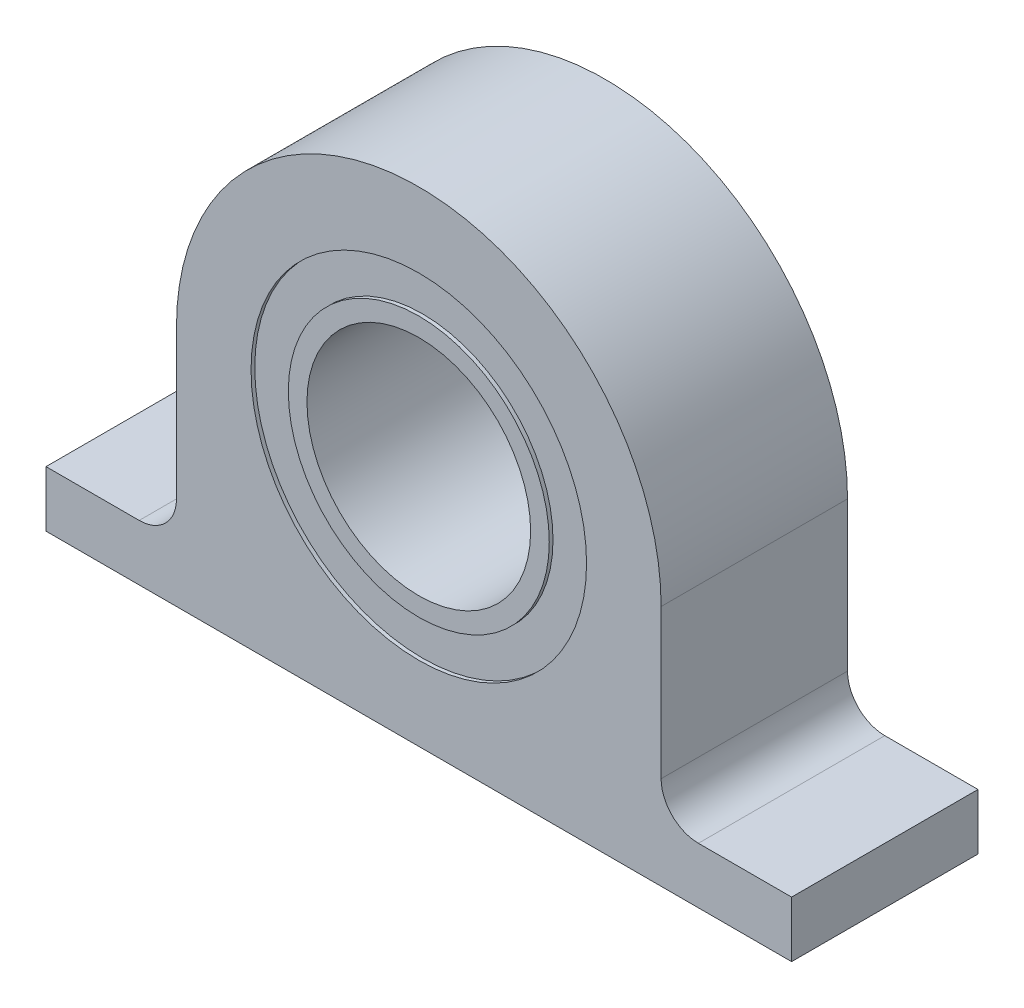
ISO-10303-21;
HEADER;
FILE_DESCRIPTION(('STEP AP214'),'2;1');
FILE_NAME('part.step','',(''),(''),'','','');
FILE_SCHEMA(('AUTOMOTIVE_DESIGN { 1 0 10303 214 1 1 1 1 }'));
ENDSEC;
DATA;
#1=APPLICATION_CONTEXT('core data for automotive mechanical design processes');
#2=APPLICATION_PROTOCOL_DEFINITION('international standard','automotive_design',2000,#1);
#3=PRODUCT_CONTEXT('',#1,'mechanical');
#4=PRODUCT('Part','Part','',(#3));
#5=PRODUCT_RELATED_PRODUCT_CATEGORY('part','',(#4));
#6=PRODUCT_DEFINITION_FORMATION('','',#4);
#7=PRODUCT_DEFINITION_CONTEXT('part definition',#1,'design');
#8=PRODUCT_DEFINITION('design','',#6,#7);
#9=PRODUCT_DEFINITION_SHAPE('','',#8);
#10=(LENGTH_UNIT() NAMED_UNIT(*) SI_UNIT(.MILLI.,.METRE.));
#11=(NAMED_UNIT(*) PLANE_ANGLE_UNIT() SI_UNIT($,.RADIAN.));
#12=(NAMED_UNIT(*) SI_UNIT($,.STERADIAN.) SOLID_ANGLE_UNIT());
#13=UNCERTAINTY_MEASURE_WITH_UNIT(LENGTH_MEASURE(1.E-05),#10,'distance_accuracy_value','');
#14=(GEOMETRIC_REPRESENTATION_CONTEXT(3) GLOBAL_UNCERTAINTY_ASSIGNED_CONTEXT((#13)) GLOBAL_UNIT_ASSIGNED_CONTEXT((#10,
#11,#12)) REPRESENTATION_CONTEXT('',''));
#15=CARTESIAN_POINT('',(0.,0.,0.));
#16=DIRECTION('',(0.,0.,1.));
#17=DIRECTION('',(1.,0.,0.));
#18=AXIS2_PLACEMENT_3D('',#15,#16,#17);
#19=CARTESIAN_POINT('',(0.,0.,0.));
#20=DIRECTION('',(0.,0.,1.));
#21=DIRECTION('',(1.,0.,0.));
#22=AXIS2_PLACEMENT_3D('',#19,#20,#21);
#23=PLANE('',#22);
#24=CARTESIAN_POINT('',(0.,0.,0.));
#25=DIRECTION('',(0.,0.,1.));
#26=DIRECTION('',(1.,0.,0.));
#27=AXIS2_PLACEMENT_3D('',#24,#25,#26);
#28=CIRCLE('',#27,7.62);
#29=CARTESIAN_POINT('',(7.62,0.,0.));
#30=VERTEX_POINT('',#29);
#31=EDGE_CURVE('E38',#30,#30,#28,.T.);
#32=ORIENTED_EDGE('',*,*,#31,.T.);
#33=EDGE_LOOP('',(#32));
#34=FACE_BOUND('',#33,.T.);
#35=CARTESIAN_POINT('',(0.,0.,0.));
#36=DIRECTION('',(0.,0.,1.));
#37=DIRECTION('',(1.,0.,0.));
#38=AXIS2_PLACEMENT_3D('',#35,#36,#37);
#39=CIRCLE('',#38,8.89);
#40=CARTESIAN_POINT('',(8.89,0.,0.));
#41=VERTEX_POINT('',#40);
#42=EDGE_CURVE('E195',#41,#41,#39,.T.);
#43=ORIENTED_EDGE('',*,*,#42,.F.);
#44=EDGE_LOOP('',(#43));
#45=FACE_BOUND('',#44,.T.);
#46=ADVANCED_FACE('F34',(#34,#45),#23,.F.);
#47=CARTESIAN_POINT('',(0.,0.,12.7));
#48=DIRECTION('',(0.,0.,1.));
#49=DIRECTION('',(1.,0.,0.));
#50=AXIS2_PLACEMENT_3D('',#47,#48,#49);
#51=PLANE('',#50);
#52=CARTESIAN_POINT('',(0.,0.,12.7));
#53=DIRECTION('',(0.,0.,1.));
#54=DIRECTION('',(1.,0.,0.));
#55=AXIS2_PLACEMENT_3D('',#52,#53,#54);
#56=CIRCLE('',#55,7.62);
#57=CARTESIAN_POINT('',(7.62,0.,12.7));
#58=VERTEX_POINT('',#57);
#59=EDGE_CURVE('E11',#58,#58,#56,.T.);
#60=ORIENTED_EDGE('',*,*,#59,.F.);
#61=EDGE_LOOP('',(#60));
#62=FACE_BOUND('',#61,.T.);
#63=CARTESIAN_POINT('',(0.,0.,12.7));
#64=DIRECTION('',(0.,0.,1.));
#65=DIRECTION('',(1.,0.,0.));
#66=AXIS2_PLACEMENT_3D('',#63,#64,#65);
#67=CIRCLE('',#66,8.89);
#68=CARTESIAN_POINT('',(8.89,0.,12.7));
#69=VERTEX_POINT('',#68);
#70=EDGE_CURVE('E203',#69,#69,#67,.T.);
#71=ORIENTED_EDGE('',*,*,#70,.T.);
#72=EDGE_LOOP('',(#71));
#73=FACE_BOUND('',#72,.T.);
#74=ADVANCED_FACE('F223',(#62,#73),#51,.T.);
#75=CARTESIAN_POINT('',(0.,0.,12.7));
#76=DIRECTION('',(0.,0.,1.));
#77=DIRECTION('',(1.,0.,0.));
#78=AXIS2_PLACEMENT_3D('',#75,#76,#77);
#79=CIRCLE('',#78,11.43);
#80=CARTESIAN_POINT('',(11.43,0.,12.7));
#81=VERTEX_POINT('',#80);
#82=EDGE_CURVE('E212',#81,#81,#79,.T.);
#83=ORIENTED_EDGE('',*,*,#82,.F.);
#84=EDGE_LOOP('',(#83));
#85=FACE_BOUND('',#84,.T.);
#86=DIRECTION('',(-1.,0.,0.));
#87=VECTOR('',#86,1.);
#88=CARTESIAN_POINT('',(-25.4,-12.7,12.7));
#89=LINE('',#88,#87);
#90=CARTESIAN_POINT('',(-19.05,-12.7,12.7));
#91=VERTEX_POINT('',#90);
#92=CARTESIAN_POINT('',(-25.4,-12.7,12.7));
#93=VERTEX_POINT('',#92);
#94=EDGE_CURVE('E115',#91,#93,#89,.T.);
#95=ORIENTED_EDGE('',*,*,#94,.T.);
#96=DIRECTION('',(0.,-1.,0.));
#97=VECTOR('',#96,1.);
#98=CARTESIAN_POINT('',(-25.4,-12.7,12.7));
#99=LINE('',#98,#97);
#100=CARTESIAN_POINT('',(-25.4,-16.51,12.7));
#101=VERTEX_POINT('',#100);
#102=EDGE_CURVE('E124',#93,#101,#99,.T.);
#103=ORIENTED_EDGE('',*,*,#102,.T.);
#104=DIRECTION('',(1.,0.,0.));
#105=VECTOR('',#104,1.);
#106=CARTESIAN_POINT('',(-25.4,-16.51,12.7));
#107=LINE('',#106,#105);
#108=CARTESIAN_POINT('',(25.4,-16.51,12.7));
#109=VERTEX_POINT('',#108);
#110=EDGE_CURVE('E57',#101,#109,#107,.T.);
#111=ORIENTED_EDGE('',*,*,#110,.T.);
#112=DIRECTION('',(0.,1.,0.));
#113=VECTOR('',#112,1.);
#114=CARTESIAN_POINT('',(25.4,-12.7,12.7));
#115=LINE('',#114,#113);
#116=CARTESIAN_POINT('',(25.4,-12.7,12.7));
#117=VERTEX_POINT('',#116);
#118=EDGE_CURVE('E150',#109,#117,#115,.T.);
#119=ORIENTED_EDGE('',*,*,#118,.T.);
#120=DIRECTION('',(-1.,0.,0.));
#121=VECTOR('',#120,1.);
#122=CARTESIAN_POINT('',(19.05,-12.7,12.7));
#123=LINE('',#122,#121);
#124=CARTESIAN_POINT('',(19.05,-12.7,12.7));
#125=VERTEX_POINT('',#124);
#126=EDGE_CURVE('E147',#117,#125,#123,.T.);
#127=ORIENTED_EDGE('',*,*,#126,.T.);
#128=CARTESIAN_POINT('',(19.05,-10.16,12.7));
#129=DIRECTION('',(0.,0.,1.));
#130=DIRECTION('',(1.,0.,0.));
#131=AXIS2_PLACEMENT_3D('',#128,#129,#130);
#132=CIRCLE('',#131,2.54);
#133=CARTESIAN_POINT('',(16.51,-10.16,12.7));
#134=VERTEX_POINT('',#133);
#135=EDGE_CURVE('E144',#125,#134,#132,.F.);
#136=ORIENTED_EDGE('',*,*,#135,.T.);
#137=DIRECTION('',(0.,1.,0.));
#138=VECTOR('',#137,1.);
#139=CARTESIAN_POINT('',(16.51,-10.16,12.7));
#140=LINE('',#139,#138);
#141=CARTESIAN_POINT('',(16.51,0.,12.7));
#142=VERTEX_POINT('',#141);
#143=EDGE_CURVE('E141',#134,#142,#140,.T.);
#144=ORIENTED_EDGE('',*,*,#143,.T.);
#145=CARTESIAN_POINT('',(0.,0.,12.7));
#146=DIRECTION('',(0.,0.,1.));
#147=DIRECTION('',(1.,0.,0.));
#148=AXIS2_PLACEMENT_3D('',#145,#146,#147);
#149=CIRCLE('',#148,16.51);
#150=CARTESIAN_POINT('',(-16.51,0.,12.7));
#151=VERTEX_POINT('',#150);
#152=EDGE_CURVE('E138',#142,#151,#149,.T.);
#153=ORIENTED_EDGE('',*,*,#152,.T.);
#154=DIRECTION('',(0.,-1.,0.));
#155=VECTOR('',#154,1.);
#156=CARTESIAN_POINT('',(-16.51,0.,12.7));
#157=LINE('',#156,#155);
#158=CARTESIAN_POINT('',(-16.51,-10.16,12.7));
#159=VERTEX_POINT('',#158);
#160=EDGE_CURVE('E134',#151,#159,#157,.T.);
#161=ORIENTED_EDGE('',*,*,#160,.T.);
#162=CARTESIAN_POINT('',(-19.05,-10.16,12.7));
#163=DIRECTION('',(0.,0.,1.));
#164=DIRECTION('',(1.,0.,0.));
#165=AXIS2_PLACEMENT_3D('',#162,#163,#164);
#166=CIRCLE('',#165,2.54);
#167=EDGE_CURVE('E132',#159,#91,#166,.F.);
#168=ORIENTED_EDGE('',*,*,#167,.T.);
#169=EDGE_LOOP('',(#95,#103,#111,#119,#127,#136,#144,#153,#161,#168));
#170=FACE_BOUND('',#169,.T.);
#171=ADVANCED_FACE('F130',(#85,#170),#51,.T.);
#172=CARTESIAN_POINT('',(0.,0.,0.));
#173=DIRECTION('',(0.,0.,1.));
#174=DIRECTION('',(1.,0.,0.));
#175=AXIS2_PLACEMENT_3D('',#172,#173,#174);
#176=CIRCLE('',#175,11.43);
#177=CARTESIAN_POINT('',(11.43,0.,0.));
#178=VERTEX_POINT('',#177);
#179=EDGE_CURVE('E200',#178,#178,#176,.T.);
#180=ORIENTED_EDGE('',*,*,#179,.T.);
#181=EDGE_LOOP('',(#180));
#182=FACE_BOUND('',#181,.T.);
#183=DIRECTION('',(0.,-1.,0.));
#184=VECTOR('',#183,1.);
#185=CARTESIAN_POINT('',(-25.4,-12.7,0.));
#186=LINE('',#185,#184);
#187=CARTESIAN_POINT('',(-25.4,-12.7,0.));
#188=VERTEX_POINT('',#187);
#189=CARTESIAN_POINT('',(-25.4,-16.51,0.));
#190=VERTEX_POINT('',#189);
#191=EDGE_CURVE('E128',#188,#190,#186,.T.);
#192=ORIENTED_EDGE('',*,*,#191,.F.);
#193=DIRECTION('',(-1.,0.,0.));
#194=VECTOR('',#193,1.);
#195=CARTESIAN_POINT('',(-25.4,-12.7,0.));
#196=LINE('',#195,#194);
#197=CARTESIAN_POINT('',(-19.05,-12.7,0.));
#198=VERTEX_POINT('',#197);
#199=EDGE_CURVE('E118',#198,#188,#196,.T.);
#200=ORIENTED_EDGE('',*,*,#199,.F.);
#201=CARTESIAN_POINT('',(-19.05,-10.16,0.));
#202=DIRECTION('',(0.,0.,-1.));
#203=DIRECTION('',(1.,0.,0.));
#204=AXIS2_PLACEMENT_3D('',#201,#202,#203);
#205=CIRCLE('',#204,2.54);
#206=CARTESIAN_POINT('',(-16.51,-10.16,0.));
#207=VERTEX_POINT('',#206);
#208=EDGE_CURVE('E176',#207,#198,#205,.T.);
#209=ORIENTED_EDGE('',*,*,#208,.F.);
#210=DIRECTION('',(0.,-1.,0.));
#211=VECTOR('',#210,1.);
#212=CARTESIAN_POINT('',(-16.51,0.,0.));
#213=LINE('',#212,#211);
#214=CARTESIAN_POINT('',(-16.51,0.,0.));
#215=VERTEX_POINT('',#214);
#216=EDGE_CURVE('E173',#215,#207,#213,.T.);
#217=ORIENTED_EDGE('',*,*,#216,.F.);
#218=CARTESIAN_POINT('',(0.,0.,0.));
#219=DIRECTION('',(0.,0.,1.));
#220=DIRECTION('',(-1.,0.,0.));
#221=AXIS2_PLACEMENT_3D('',#218,#219,#220);
#222=CIRCLE('',#221,16.51);
#223=CARTESIAN_POINT('',(16.51,0.,0.));
#224=VERTEX_POINT('',#223);
#225=EDGE_CURVE('E170',#224,#215,#222,.T.);
#226=ORIENTED_EDGE('',*,*,#225,.F.);
#227=DIRECTION('',(0.,1.,0.));
#228=VECTOR('',#227,1.);
#229=CARTESIAN_POINT('',(16.51,-10.16,0.));
#230=LINE('',#229,#228);
#231=CARTESIAN_POINT('',(16.51,-10.16,0.));
#232=VERTEX_POINT('',#231);
#233=EDGE_CURVE('E167',#232,#224,#230,.T.);
#234=ORIENTED_EDGE('',*,*,#233,.F.);
#235=CARTESIAN_POINT('',(19.05,-10.16,0.));
#236=DIRECTION('',(0.,0.,-1.));
#237=DIRECTION('',(1.,0.,0.));
#238=AXIS2_PLACEMENT_3D('',#235,#236,#237);
#239=CIRCLE('',#238,2.54);
#240=CARTESIAN_POINT('',(19.05,-12.7,0.));
#241=VERTEX_POINT('',#240);
#242=EDGE_CURVE('E164',#241,#232,#239,.T.);
#243=ORIENTED_EDGE('',*,*,#242,.F.);
#244=DIRECTION('',(-1.,0.,0.));
#245=VECTOR('',#244,1.);
#246=CARTESIAN_POINT('',(19.05,-12.7,0.));
#247=LINE('',#246,#245);
#248=CARTESIAN_POINT('',(25.4,-12.7,0.));
#249=VERTEX_POINT('',#248);
#250=EDGE_CURVE('E161',#249,#241,#247,.T.);
#251=ORIENTED_EDGE('',*,*,#250,.F.);
#252=DIRECTION('',(0.,1.,0.));
#253=VECTOR('',#252,1.);
#254=CARTESIAN_POINT('',(25.4,-12.7,0.));
#255=LINE('',#254,#253);
#256=CARTESIAN_POINT('',(25.4,-16.51,0.));
#257=VERTEX_POINT('',#256);
#258=EDGE_CURVE('E158',#257,#249,#255,.T.);
#259=ORIENTED_EDGE('',*,*,#258,.F.);
#260=DIRECTION('',(1.,0.,0.));
#261=VECTOR('',#260,1.);
#262=CARTESIAN_POINT('',(-25.4,-16.51,0.));
#263=LINE('',#262,#261);
#264=EDGE_CURVE('E155',#190,#257,#263,.T.);
#265=ORIENTED_EDGE('',*,*,#264,.F.);
#266=EDGE_LOOP('',(#192,#200,#209,#217,#226,#234,#243,#251,#259,#265));
#267=FACE_BOUND('',#266,.T.);
#268=ADVANCED_FACE('F36',(#182,#267),#23,.F.);
#269=CARTESIAN_POINT('',(0.,0.,12.7));
#270=DIRECTION('',(0.,0.,-1.));
#271=DIRECTION('',(-1.,0.,0.));
#272=AXIS2_PLACEMENT_3D('',#269,#270,#271);
#273=CYLINDRICAL_SURFACE('',#272,7.62);
#274=ORIENTED_EDGE('',*,*,#59,.T.);
#275=EDGE_LOOP('',(#274));
#276=FACE_BOUND('',#275,.T.);
#277=ORIENTED_EDGE('',*,*,#31,.F.);
#278=EDGE_LOOP('',(#277));
#279=FACE_BOUND('',#278,.T.);
#280=ADVANCED_FACE('F228',(#276,#279),#273,.F.);
#281=CARTESIAN_POINT('',(0.,0.,12.446));
#282=DIRECTION('',(0.,0.,1.));
#283=DIRECTION('',(1.,0.,0.));
#284=AXIS2_PLACEMENT_3D('',#281,#282,#283);
#285=CYLINDRICAL_SURFACE('',#284,8.89);
#286=CARTESIAN_POINT('',(0.,0.,12.446));
#287=DIRECTION('',(0.,0.,1.));
#288=DIRECTION('',(1.,0.,0.));
#289=AXIS2_PLACEMENT_3D('',#286,#287,#288);
#290=CIRCLE('',#289,8.89);
#291=CARTESIAN_POINT('',(8.89,0.,12.446));
#292=VERTEX_POINT('',#291);
#293=EDGE_CURVE('E208',#292,#292,#290,.T.);
#294=ORIENTED_EDGE('',*,*,#293,.T.);
#295=EDGE_LOOP('',(#294));
#296=FACE_BOUND('',#295,.T.);
#297=ORIENTED_EDGE('',*,*,#70,.F.);
#298=EDGE_LOOP('',(#297));
#299=FACE_BOUND('',#298,.T.);
#300=ADVANCED_FACE('F261',(#296,#299),#285,.T.);
#301=CARTESIAN_POINT('',(0.,0.,12.446));
#302=DIRECTION('',(0.,0.,1.));
#303=DIRECTION('',(1.,0.,0.));
#304=AXIS2_PLACEMENT_3D('',#301,#302,#303);
#305=CYLINDRICAL_SURFACE('',#304,11.43);
#306=CARTESIAN_POINT('',(0.,0.,12.446));
#307=DIRECTION('',(0.,0.,1.));
#308=DIRECTION('',(1.,0.,0.));
#309=AXIS2_PLACEMENT_3D('',#306,#307,#308);
#310=CIRCLE('',#309,11.43);
#311=CARTESIAN_POINT('',(11.43,0.,12.446));
#312=VERTEX_POINT('',#311);
#313=EDGE_CURVE('E211',#312,#312,#310,.T.);
#314=ORIENTED_EDGE('',*,*,#313,.F.);
#315=EDGE_LOOP('',(#314));
#316=FACE_BOUND('',#315,.T.);
#317=ORIENTED_EDGE('',*,*,#82,.T.);
#318=EDGE_LOOP('',(#317));
#319=FACE_BOUND('',#318,.T.);
#320=ADVANCED_FACE('F220',(#316,#319),#305,.F.);
#321=CARTESIAN_POINT('',(0.,0.,12.446));
#322=DIRECTION('',(0.,0.,1.));
#323=DIRECTION('',(1.,0.,0.));
#324=AXIS2_PLACEMENT_3D('',#321,#322,#323);
#325=PLANE('',#324);
#326=ORIENTED_EDGE('',*,*,#293,.F.);
#327=EDGE_LOOP('',(#326));
#328=FACE_BOUND('',#327,.T.);
#329=ORIENTED_EDGE('',*,*,#313,.T.);
#330=EDGE_LOOP('',(#329));
#331=FACE_BOUND('',#330,.T.);
#332=ADVANCED_FACE('F244',(#328,#331),#325,.T.);
#333=CARTESIAN_POINT('',(0.,0.,0.254));
#334=DIRECTION('',(0.,0.,-1.));
#335=DIRECTION('',(-1.,0.,0.));
#336=AXIS2_PLACEMENT_3D('',#333,#334,#335);
#337=CYLINDRICAL_SURFACE('',#336,8.89);
#338=CARTESIAN_POINT('',(0.,0.,0.254));
#339=DIRECTION('',(0.,0.,1.));
#340=DIRECTION('',(1.,0.,0.));
#341=AXIS2_PLACEMENT_3D('',#338,#339,#340);
#342=CIRCLE('',#341,8.89);
#343=CARTESIAN_POINT('',(8.89,0.,0.254));
#344=VERTEX_POINT('',#343);
#345=EDGE_CURVE('E196',#344,#344,#342,.T.);
#346=ORIENTED_EDGE('',*,*,#345,.F.);
#347=EDGE_LOOP('',(#346));
#348=FACE_BOUND('',#347,.T.);
#349=ORIENTED_EDGE('',*,*,#42,.T.);
#350=EDGE_LOOP('',(#349));
#351=FACE_BOUND('',#350,.T.);
#352=ADVANCED_FACE('F241',(#348,#351),#337,.T.);
#353=CARTESIAN_POINT('',(0.,0.,0.254));
#354=DIRECTION('',(0.,0.,-1.));
#355=DIRECTION('',(-1.,0.,0.));
#356=AXIS2_PLACEMENT_3D('',#353,#354,#355);
#357=CYLINDRICAL_SURFACE('',#356,11.43);
#358=CARTESIAN_POINT('',(0.,0.,0.254));
#359=DIRECTION('',(0.,0.,1.));
#360=DIRECTION('',(1.,0.,0.));
#361=AXIS2_PLACEMENT_3D('',#358,#359,#360);
#362=CIRCLE('',#361,11.43);
#363=CARTESIAN_POINT('',(11.43,0.,0.254));
#364=VERTEX_POINT('',#363);
#365=EDGE_CURVE('E199',#364,#364,#362,.T.);
#366=ORIENTED_EDGE('',*,*,#365,.T.);
#367=EDGE_LOOP('',(#366));
#368=FACE_BOUND('',#367,.T.);
#369=ORIENTED_EDGE('',*,*,#179,.F.);
#370=EDGE_LOOP('',(#369));
#371=FACE_BOUND('',#370,.T.);
#372=ADVANCED_FACE('F243',(#368,#371),#357,.F.);
#373=CARTESIAN_POINT('',(0.,0.,0.254));
#374=DIRECTION('',(0.,0.,-1.));
#375=DIRECTION('',(1.,0.,0.));
#376=AXIS2_PLACEMENT_3D('',#373,#374,#375);
#377=PLANE('',#376);
#378=ORIENTED_EDGE('',*,*,#345,.T.);
#379=EDGE_LOOP('',(#378));
#380=FACE_BOUND('',#379,.T.);
#381=ORIENTED_EDGE('',*,*,#365,.F.);
#382=EDGE_LOOP('',(#381));
#383=FACE_BOUND('',#382,.T.);
#384=ADVANCED_FACE('F251',(#380,#383),#377,.T.);
#385=CARTESIAN_POINT('',(-25.4,-12.7,73.2884510447329));
#386=DIRECTION('',(0.,-1.,0.));
#387=DIRECTION('',(0.,0.,-1.));
#388=AXIS2_PLACEMENT_3D('',#385,#386,#387);
#389=PLANE('',#388);
#390=ORIENTED_EDGE('',*,*,#94,.F.);
#391=DIRECTION('',(0.,0.,-1.));
#392=VECTOR('',#391,1.);
#393=CARTESIAN_POINT('',(-19.05,-12.7,73.2884510447329));
#394=LINE('',#393,#392);
#395=EDGE_CURVE('E49',#91,#198,#394,.T.);
#396=ORIENTED_EDGE('',*,*,#395,.T.);
#397=ORIENTED_EDGE('',*,*,#199,.T.);
#398=DIRECTION('',(0.,0.,-1.));
#399=VECTOR('',#398,1.);
#400=CARTESIAN_POINT('',(-25.4,-12.7,73.2884510447329));
#401=LINE('',#400,#399);
#402=EDGE_CURVE('E111',#93,#188,#401,.T.);
#403=ORIENTED_EDGE('',*,*,#402,.F.);
#404=EDGE_LOOP('',(#390,#396,#397,#403));
#405=FACE_BOUND('',#404,.T.);
#406=ADVANCED_FACE('F113',(#405),#389,.F.);
#407=CARTESIAN_POINT('',(-19.05,-10.16,73.2884510447329));
#408=DIRECTION('',(0.,0.,-1.));
#409=DIRECTION('',(-1.,0.,0.));
#410=AXIS2_PLACEMENT_3D('',#407,#408,#409);
#411=CYLINDRICAL_SURFACE('',#410,2.54);
#412=ORIENTED_EDGE('',*,*,#167,.F.);
#413=DIRECTION('',(0.,0.,-1.));
#414=VECTOR('',#413,1.);
#415=CARTESIAN_POINT('',(-16.51,-10.16,73.2884510447329));
#416=LINE('',#415,#414);
#417=EDGE_CURVE('E180',#159,#207,#416,.T.);
#418=ORIENTED_EDGE('',*,*,#417,.T.);
#419=ORIENTED_EDGE('',*,*,#208,.T.);
#420=ORIENTED_EDGE('',*,*,#395,.F.);
#421=EDGE_LOOP('',(#412,#418,#419,#420));
#422=FACE_BOUND('',#421,.T.);
#423=ADVANCED_FACE('F307',(#422),#411,.F.);
#424=CARTESIAN_POINT('',(-16.51,0.,73.2884510447329));
#425=DIRECTION('',(1.,0.,0.));
#426=DIRECTION('',(0.,0.,-1.));
#427=AXIS2_PLACEMENT_3D('',#424,#425,#426);
#428=PLANE('',#427);
#429=ORIENTED_EDGE('',*,*,#160,.F.);
#430=DIRECTION('',(0.,0.,-1.));
#431=VECTOR('',#430,1.);
#432=CARTESIAN_POINT('',(-16.51,0.,73.2884510447329));
#433=LINE('',#432,#431);
#434=EDGE_CURVE('E182',#151,#215,#433,.T.);
#435=ORIENTED_EDGE('',*,*,#434,.T.);
#436=ORIENTED_EDGE('',*,*,#216,.T.);
#437=ORIENTED_EDGE('',*,*,#417,.F.);
#438=EDGE_LOOP('',(#429,#435,#436,#437));
#439=FACE_BOUND('',#438,.T.);
#440=ADVANCED_FACE('F314',(#439),#428,.F.);
#441=CARTESIAN_POINT('',(0.,0.,73.2884510447329));
#442=DIRECTION('',(0.,0.,-1.));
#443=DIRECTION('',(-1.,0.,0.));
#444=AXIS2_PLACEMENT_3D('',#441,#442,#443);
#445=CYLINDRICAL_SURFACE('',#444,16.51);
#446=ORIENTED_EDGE('',*,*,#152,.F.);
#447=DIRECTION('',(0.,0.,-1.));
#448=VECTOR('',#447,1.);
#449=CARTESIAN_POINT('',(16.51,0.,73.2884510447329));
#450=LINE('',#449,#448);
#451=EDGE_CURVE('E184',#142,#224,#450,.T.);
#452=ORIENTED_EDGE('',*,*,#451,.T.);
#453=ORIENTED_EDGE('',*,*,#225,.T.);
#454=ORIENTED_EDGE('',*,*,#434,.F.);
#455=EDGE_LOOP('',(#446,#452,#453,#454));
#456=FACE_BOUND('',#455,.T.);
#457=ADVANCED_FACE('F321',(#456),#445,.T.);
#458=CARTESIAN_POINT('',(16.51,-10.16,73.2884510447329));
#459=DIRECTION('',(-1.,0.,0.));
#460=DIRECTION('',(0.,0.,1.));
#461=AXIS2_PLACEMENT_3D('',#458,#459,#460);
#462=PLANE('',#461);
#463=ORIENTED_EDGE('',*,*,#143,.F.);
#464=DIRECTION('',(0.,0.,-1.));
#465=VECTOR('',#464,1.);
#466=CARTESIAN_POINT('',(16.51,-10.16,73.2884510447329));
#467=LINE('',#466,#465);
#468=EDGE_CURVE('E186',#134,#232,#467,.T.);
#469=ORIENTED_EDGE('',*,*,#468,.T.);
#470=ORIENTED_EDGE('',*,*,#233,.T.);
#471=ORIENTED_EDGE('',*,*,#451,.F.);
#472=EDGE_LOOP('',(#463,#469,#470,#471));
#473=FACE_BOUND('',#472,.T.);
#474=ADVANCED_FACE('F329',(#473),#462,.F.);
#475=CARTESIAN_POINT('',(19.05,-10.16,73.2884510447329));
#476=DIRECTION('',(0.,0.,-1.));
#477=DIRECTION('',(-1.,0.,0.));
#478=AXIS2_PLACEMENT_3D('',#475,#476,#477);
#479=CYLINDRICAL_SURFACE('',#478,2.54);
#480=ORIENTED_EDGE('',*,*,#135,.F.);
#481=DIRECTION('',(0.,0.,-1.));
#482=VECTOR('',#481,1.);
#483=CARTESIAN_POINT('',(19.05,-12.7,73.2884510447329));
#484=LINE('',#483,#482);
#485=EDGE_CURVE('E188',#125,#241,#484,.T.);
#486=ORIENTED_EDGE('',*,*,#485,.T.);
#487=ORIENTED_EDGE('',*,*,#242,.T.);
#488=ORIENTED_EDGE('',*,*,#468,.F.);
#489=EDGE_LOOP('',(#480,#486,#487,#488));
#490=FACE_BOUND('',#489,.T.);
#491=ADVANCED_FACE('F337',(#490),#479,.F.);
#492=CARTESIAN_POINT('',(19.05,-12.7,73.2884510447329));
#493=DIRECTION('',(0.,-1.,0.));
#494=DIRECTION('',(1.,0.,0.));
#495=AXIS2_PLACEMENT_3D('',#492,#493,#494);
#496=PLANE('',#495);
#497=ORIENTED_EDGE('',*,*,#126,.F.);
#498=DIRECTION('',(0.,0.,-1.));
#499=VECTOR('',#498,1.);
#500=CARTESIAN_POINT('',(25.4,-12.7,73.2884510447329));
#501=LINE('',#500,#499);
#502=EDGE_CURVE('E190',#117,#249,#501,.T.);
#503=ORIENTED_EDGE('',*,*,#502,.T.);
#504=ORIENTED_EDGE('',*,*,#250,.T.);
#505=ORIENTED_EDGE('',*,*,#485,.F.);
#506=EDGE_LOOP('',(#497,#503,#504,#505));
#507=FACE_BOUND('',#506,.T.);
#508=ADVANCED_FACE('F345',(#507),#496,.F.);
#509=CARTESIAN_POINT('',(25.4,-12.7,73.2884510447329));
#510=DIRECTION('',(-1.,0.,0.));
#511=DIRECTION('',(0.,0.,1.));
#512=AXIS2_PLACEMENT_3D('',#509,#510,#511);
#513=PLANE('',#512);
#514=ORIENTED_EDGE('',*,*,#118,.F.);
#515=DIRECTION('',(0.,0.,-1.));
#516=VECTOR('',#515,1.);
#517=CARTESIAN_POINT('',(25.4,-16.51,73.2884510447329));
#518=LINE('',#517,#516);
#519=EDGE_CURVE('E192',#109,#257,#518,.T.);
#520=ORIENTED_EDGE('',*,*,#519,.T.);
#521=ORIENTED_EDGE('',*,*,#258,.T.);
#522=ORIENTED_EDGE('',*,*,#502,.F.);
#523=EDGE_LOOP('',(#514,#520,#521,#522));
#524=FACE_BOUND('',#523,.T.);
#525=ADVANCED_FACE('F353',(#524),#513,.F.);
#526=CARTESIAN_POINT('',(-25.4,-16.51,73.2884510447329));
#527=DIRECTION('',(0.,1.,0.));
#528=DIRECTION('',(-1.,0.,0.));
#529=AXIS2_PLACEMENT_3D('',#526,#527,#528);
#530=PLANE('',#529);
#531=ORIENTED_EDGE('',*,*,#110,.F.);
#532=DIRECTION('',(0.,0.,-1.));
#533=VECTOR('',#532,1.);
#534=CARTESIAN_POINT('',(-25.4,-16.51,73.2884510447329));
#535=LINE('',#534,#533);
#536=EDGE_CURVE('E126',#101,#190,#535,.T.);
#537=ORIENTED_EDGE('',*,*,#536,.T.);
#538=ORIENTED_EDGE('',*,*,#264,.T.);
#539=ORIENTED_EDGE('',*,*,#519,.F.);
#540=EDGE_LOOP('',(#531,#537,#538,#539));
#541=FACE_BOUND('',#540,.T.);
#542=ADVANCED_FACE('F361',(#541),#530,.F.);
#543=CARTESIAN_POINT('',(-25.4,-12.7,73.2884510447329));
#544=DIRECTION('',(1.,0.,0.));
#545=DIRECTION('',(0.,0.,-1.));
#546=AXIS2_PLACEMENT_3D('',#543,#544,#545);
#547=PLANE('',#546);
#548=ORIENTED_EDGE('',*,*,#102,.F.);
#549=ORIENTED_EDGE('',*,*,#402,.T.);
#550=ORIENTED_EDGE('',*,*,#191,.T.);
#551=ORIENTED_EDGE('',*,*,#536,.F.);
#552=EDGE_LOOP('',(#548,#549,#550,#551));
#553=FACE_BOUND('',#552,.T.);
#554=ADVANCED_FACE('F125',(#553),#547,.F.);
#555=CLOSED_SHELL('',(#46,#74,#171,#268,#280,#300,#320,#332,#352,#372,#384,#406,#423,#440,#457,
#474,#491,#508,#525,#542,#554));
#556=MANIFOLD_SOLID_BREP('B2',#555);
#557=ADVANCED_BREP_SHAPE_REPRESENTATION('',(#18,#556),#14);
#558=SHAPE_DEFINITION_REPRESENTATION(#9,#557);
ENDSEC;
END-ISO-10303-21;
